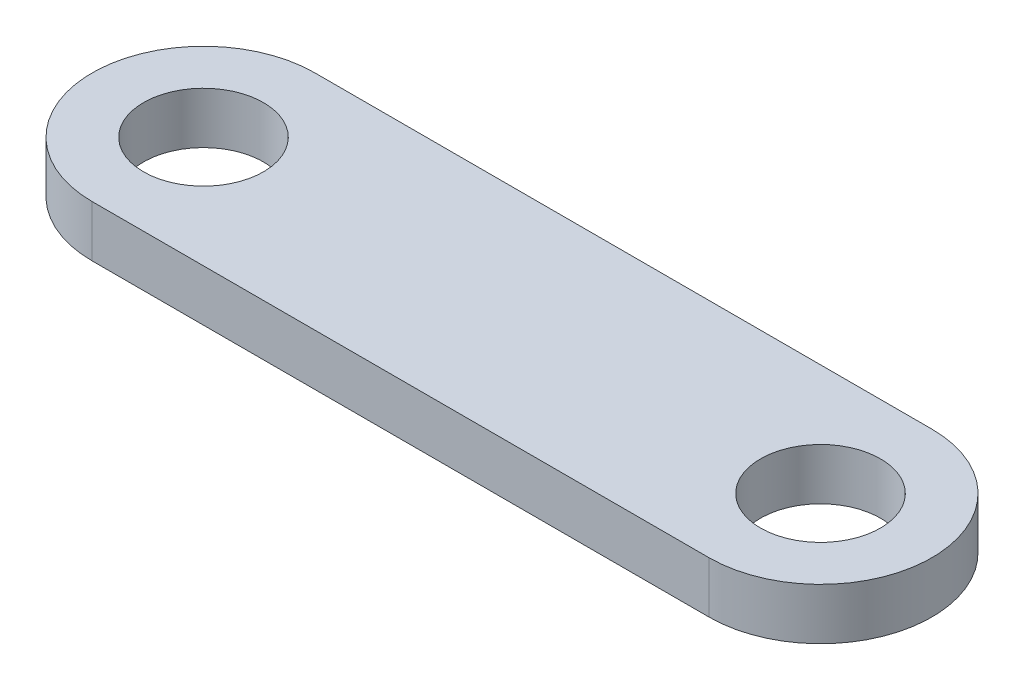
ISO-10303-21;
HEADER;
FILE_DESCRIPTION(('STEP AP214'),'2;1');
FILE_NAME('part.step','',(''),(''),'','','');
FILE_SCHEMA(('AUTOMOTIVE_DESIGN { 1 0 10303 214 1 1 1 1 }'));
ENDSEC;
DATA;
#1=APPLICATION_CONTEXT('core data for automotive mechanical design processes');
#2=APPLICATION_PROTOCOL_DEFINITION('international standard','automotive_design',2000,#1);
#3=PRODUCT_CONTEXT('',#1,'mechanical');
#4=PRODUCT('Part','Part','',(#3));
#5=PRODUCT_RELATED_PRODUCT_CATEGORY('part','',(#4));
#6=PRODUCT_DEFINITION_FORMATION('','',#4);
#7=PRODUCT_DEFINITION_CONTEXT('part definition',#1,'design');
#8=PRODUCT_DEFINITION('design','',#6,#7);
#9=PRODUCT_DEFINITION_SHAPE('','',#8);
#10=(LENGTH_UNIT() NAMED_UNIT(*) SI_UNIT(.MILLI.,.METRE.));
#11=(NAMED_UNIT(*) PLANE_ANGLE_UNIT() SI_UNIT($,.RADIAN.));
#12=(NAMED_UNIT(*) SI_UNIT($,.STERADIAN.) SOLID_ANGLE_UNIT());
#13=UNCERTAINTY_MEASURE_WITH_UNIT(LENGTH_MEASURE(1.E-05),#10,'distance_accuracy_value','');
#14=(GEOMETRIC_REPRESENTATION_CONTEXT(3) GLOBAL_UNCERTAINTY_ASSIGNED_CONTEXT((#13)) GLOBAL_UNIT_ASSIGNED_CONTEXT((#10,
#11,#12)) REPRESENTATION_CONTEXT('',''));
#15=CARTESIAN_POINT('',(0.,0.,0.));
#16=DIRECTION('',(0.,0.,1.));
#17=DIRECTION('',(1.,0.,0.));
#18=AXIS2_PLACEMENT_3D('',#15,#16,#17);
#19=CARTESIAN_POINT('',(-18.,3.,0.));
#20=DIRECTION('',(0.,1.,0.));
#21=DIRECTION('',(0.,0.,1.));
#22=AXIS2_PLACEMENT_3D('',#19,#20,#21);
#23=PLANE('',#22);
#24=CARTESIAN_POINT('',(-18.,3.,0.));
#25=DIRECTION('',(0.,1.,0.));
#26=DIRECTION('',(0.,0.,1.));
#27=AXIS2_PLACEMENT_3D('',#24,#25,#26);
#28=CIRCLE('',#27,3.5);
#29=CARTESIAN_POINT('',(-18.,3.,3.5));
#30=VERTEX_POINT('',#29);
#31=EDGE_CURVE('E100',#30,#30,#28,.T.);
#32=ORIENTED_EDGE('',*,*,#31,.F.);
#33=EDGE_LOOP('',(#32));
#34=FACE_BOUND('',#33,.T.);
#35=CARTESIAN_POINT('',(-18.,3.,0.));
#36=DIRECTION('',(0.,1.,0.));
#37=DIRECTION('',(0.,0.,1.));
#38=AXIS2_PLACEMENT_3D('',#35,#36,#37);
#39=CIRCLE('',#38,6.50000000000001);
#40=CARTESIAN_POINT('',(-18.,3.,-6.50000000000001));
#41=VERTEX_POINT('',#40);
#42=CARTESIAN_POINT('',(-18.,3.,6.50000000000001));
#43=VERTEX_POINT('',#42);
#44=EDGE_CURVE('E85',#41,#43,#39,.T.);
#45=ORIENTED_EDGE('',*,*,#44,.T.);
#46=DIRECTION('',(1.,0.,0.));
#47=VECTOR('',#46,1.);
#48=CARTESIAN_POINT('',(-18.,3.,6.50000000000001));
#49=LINE('',#48,#47);
#50=CARTESIAN_POINT('',(18.,3.,6.5));
#51=VERTEX_POINT('',#50);
#52=EDGE_CURVE('E80',#43,#51,#49,.T.);
#53=ORIENTED_EDGE('',*,*,#52,.T.);
#54=CARTESIAN_POINT('',(18.,3.,0.));
#55=DIRECTION('',(0.,1.,0.));
#56=DIRECTION('',(0.,0.,1.));
#57=AXIS2_PLACEMENT_3D('',#54,#55,#56);
#58=CIRCLE('',#57,6.50000000000001);
#59=CARTESIAN_POINT('',(18.,3.,-6.50000000000001));
#60=VERTEX_POINT('',#59);
#61=EDGE_CURVE('E83',#51,#60,#58,.T.);
#62=ORIENTED_EDGE('',*,*,#61,.T.);
#63=DIRECTION('',(-1.,0.,0.));
#64=VECTOR('',#63,1.);
#65=CARTESIAN_POINT('',(-18.,3.,-6.50000000000001));
#66=LINE('',#65,#64);
#67=EDGE_CURVE('E50',#60,#41,#66,.T.);
#68=ORIENTED_EDGE('',*,*,#67,.T.);
#69=EDGE_LOOP('',(#45,#53,#62,#68));
#70=FACE_BOUND('',#69,.T.);
#71=CARTESIAN_POINT('',(18.,3.,0.));
#72=DIRECTION('',(0.,1.,0.));
#73=DIRECTION('',(0.,0.,1.));
#74=AXIS2_PLACEMENT_3D('',#71,#72,#73);
#75=CIRCLE('',#74,3.5);
#76=CARTESIAN_POINT('',(18.,3.,3.49999999999999));
#77=VERTEX_POINT('',#76);
#78=EDGE_CURVE('E115',#77,#77,#75,.T.);
#79=ORIENTED_EDGE('',*,*,#78,.F.);
#80=EDGE_LOOP('',(#79));
#81=FACE_BOUND('',#80,.T.);
#82=ADVANCED_FACE('F33',(#34,#70,#81),#23,.T.);
#83=CARTESIAN_POINT('',(-18.,0.,0.));
#84=DIRECTION('',(0.,1.,0.));
#85=DIRECTION('',(0.,0.,1.));
#86=AXIS2_PLACEMENT_3D('',#83,#84,#85);
#87=PLANE('',#86);
#88=CARTESIAN_POINT('',(-18.,0.,0.));
#89=DIRECTION('',(0.,1.,0.));
#90=DIRECTION('',(0.,0.,1.));
#91=AXIS2_PLACEMENT_3D('',#88,#89,#90);
#92=CIRCLE('',#91,6.50000000000001);
#93=CARTESIAN_POINT('',(-18.,0.,-6.50000000000001));
#94=VERTEX_POINT('',#93);
#95=CARTESIAN_POINT('',(-18.,0.,6.50000000000001));
#96=VERTEX_POINT('',#95);
#97=EDGE_CURVE('E97',#94,#96,#92,.T.);
#98=ORIENTED_EDGE('',*,*,#97,.F.);
#99=DIRECTION('',(-1.,0.,0.));
#100=VECTOR('',#99,1.);
#101=CARTESIAN_POINT('',(-18.,0.,-6.50000000000001));
#102=LINE('',#101,#100);
#103=CARTESIAN_POINT('',(18.,0.,-6.50000000000001));
#104=VERTEX_POINT('',#103);
#105=EDGE_CURVE('E73',#104,#94,#102,.T.);
#106=ORIENTED_EDGE('',*,*,#105,.F.);
#107=CARTESIAN_POINT('',(18.,0.,0.));
#108=DIRECTION('',(0.,1.,0.));
#109=DIRECTION('',(0.,0.,1.));
#110=AXIS2_PLACEMENT_3D('',#107,#108,#109);
#111=CIRCLE('',#110,6.50000000000001);
#112=CARTESIAN_POINT('',(18.,0.,6.5));
#113=VERTEX_POINT('',#112);
#114=EDGE_CURVE('E67',#113,#104,#111,.T.);
#115=ORIENTED_EDGE('',*,*,#114,.F.);
#116=DIRECTION('',(1.,0.,0.));
#117=VECTOR('',#116,1.);
#118=CARTESIAN_POINT('',(-18.,0.,6.50000000000001));
#119=LINE('',#118,#117);
#120=EDGE_CURVE('E89',#96,#113,#119,.T.);
#121=ORIENTED_EDGE('',*,*,#120,.F.);
#122=EDGE_LOOP('',(#98,#106,#115,#121));
#123=FACE_BOUND('',#122,.T.);
#124=CARTESIAN_POINT('',(-18.,0.,0.));
#125=DIRECTION('',(0.,1.,0.));
#126=DIRECTION('',(0.,0.,1.));
#127=AXIS2_PLACEMENT_3D('',#124,#125,#126);
#128=CIRCLE('',#127,3.5);
#129=CARTESIAN_POINT('',(-18.,0.,3.5));
#130=VERTEX_POINT('',#129);
#131=EDGE_CURVE('E112',#130,#130,#128,.T.);
#132=ORIENTED_EDGE('',*,*,#131,.T.);
#133=EDGE_LOOP('',(#132));
#134=FACE_BOUND('',#133,.T.);
#135=CARTESIAN_POINT('',(18.,0.,0.));
#136=DIRECTION('',(0.,1.,0.));
#137=DIRECTION('',(0.,0.,1.));
#138=AXIS2_PLACEMENT_3D('',#135,#136,#137);
#139=CIRCLE('',#138,3.5);
#140=CARTESIAN_POINT('',(18.,0.,3.49999999999999));
#141=VERTEX_POINT('',#140);
#142=EDGE_CURVE('E118',#141,#141,#139,.T.);
#143=ORIENTED_EDGE('',*,*,#142,.T.);
#144=EDGE_LOOP('',(#143));
#145=FACE_BOUND('',#144,.T.);
#146=ADVANCED_FACE('F108',(#123,#134,#145),#87,.F.);
#147=CARTESIAN_POINT('',(-18.,3.,0.));
#148=DIRECTION('',(0.,-1.,0.));
#149=DIRECTION('',(0.,0.,-1.));
#150=AXIS2_PLACEMENT_3D('',#147,#148,#149);
#151=CYLINDRICAL_SURFACE('',#150,6.50000000000001);
#152=ORIENTED_EDGE('',*,*,#97,.T.);
#153=DIRECTION('',(0.,-1.,0.));
#154=VECTOR('',#153,1.);
#155=CARTESIAN_POINT('',(-18.,3.,6.50000000000001));
#156=LINE('',#155,#154);
#157=EDGE_CURVE('E11',#43,#96,#156,.T.);
#158=ORIENTED_EDGE('',*,*,#157,.F.);
#159=ORIENTED_EDGE('',*,*,#44,.F.);
#160=DIRECTION('',(0.,-1.,0.));
#161=VECTOR('',#160,1.);
#162=CARTESIAN_POINT('',(-18.,3.,-6.50000000000001));
#163=LINE('',#162,#161);
#164=EDGE_CURVE('E93',#41,#94,#163,.T.);
#165=ORIENTED_EDGE('',*,*,#164,.T.);
#166=EDGE_LOOP('',(#152,#158,#159,#165));
#167=FACE_BOUND('',#166,.T.);
#168=ADVANCED_FACE('F35',(#167),#151,.T.);
#169=CARTESIAN_POINT('',(-18.,3.,6.50000000000001));
#170=DIRECTION('',(0.,0.,-1.));
#171=DIRECTION('',(-1.,0.,0.));
#172=AXIS2_PLACEMENT_3D('',#169,#170,#171);
#173=PLANE('',#172);
#174=ORIENTED_EDGE('',*,*,#120,.T.);
#175=DIRECTION('',(0.,-1.,0.));
#176=VECTOR('',#175,1.);
#177=CARTESIAN_POINT('',(18.,3.,6.5));
#178=LINE('',#177,#176);
#179=EDGE_CURVE('E42',#51,#113,#178,.T.);
#180=ORIENTED_EDGE('',*,*,#179,.F.);
#181=ORIENTED_EDGE('',*,*,#52,.F.);
#182=ORIENTED_EDGE('',*,*,#157,.T.);
#183=EDGE_LOOP('',(#174,#180,#181,#182));
#184=FACE_BOUND('',#183,.T.);
#185=ADVANCED_FACE('F88',(#184),#173,.F.);
#186=CARTESIAN_POINT('',(18.,3.,0.));
#187=DIRECTION('',(0.,-1.,0.));
#188=DIRECTION('',(0.,0.,-1.));
#189=AXIS2_PLACEMENT_3D('',#186,#187,#188);
#190=CYLINDRICAL_SURFACE('',#189,6.50000000000001);
#191=ORIENTED_EDGE('',*,*,#114,.T.);
#192=DIRECTION('',(0.,-1.,0.));
#193=VECTOR('',#192,1.);
#194=CARTESIAN_POINT('',(18.,3.,-6.50000000000001));
#195=LINE('',#194,#193);
#196=EDGE_CURVE('E90',#60,#104,#195,.T.);
#197=ORIENTED_EDGE('',*,*,#196,.F.);
#198=ORIENTED_EDGE('',*,*,#61,.F.);
#199=ORIENTED_EDGE('',*,*,#179,.T.);
#200=EDGE_LOOP('',(#191,#197,#198,#199));
#201=FACE_BOUND('',#200,.T.);
#202=ADVANCED_FACE('F91',(#201),#190,.T.);
#203=CARTESIAN_POINT('',(-18.,3.,-6.50000000000001));
#204=DIRECTION('',(0.,0.,1.));
#205=DIRECTION('',(1.,0.,0.));
#206=AXIS2_PLACEMENT_3D('',#203,#204,#205);
#207=PLANE('',#206);
#208=ORIENTED_EDGE('',*,*,#105,.T.);
#209=ORIENTED_EDGE('',*,*,#164,.F.);
#210=ORIENTED_EDGE('',*,*,#67,.F.);
#211=ORIENTED_EDGE('',*,*,#196,.T.);
#212=EDGE_LOOP('',(#208,#209,#210,#211));
#213=FACE_BOUND('',#212,.T.);
#214=ADVANCED_FACE('F105',(#213),#207,.F.);
#215=CARTESIAN_POINT('',(-18.,3.,0.));
#216=DIRECTION('',(0.,-1.,0.));
#217=DIRECTION('',(0.,0.,-1.));
#218=AXIS2_PLACEMENT_3D('',#215,#216,#217);
#219=CYLINDRICAL_SURFACE('',#218,3.5);
#220=ORIENTED_EDGE('',*,*,#31,.T.);
#221=EDGE_LOOP('',(#220));
#222=FACE_BOUND('',#221,.T.);
#223=ORIENTED_EDGE('',*,*,#131,.F.);
#224=EDGE_LOOP('',(#223));
#225=FACE_BOUND('',#224,.T.);
#226=ADVANCED_FACE('F135',(#222,#225),#219,.F.);
#227=CARTESIAN_POINT('',(18.,3.,0.));
#228=DIRECTION('',(0.,-1.,0.));
#229=DIRECTION('',(0.,0.,-1.));
#230=AXIS2_PLACEMENT_3D('',#227,#228,#229);
#231=CYLINDRICAL_SURFACE('',#230,3.5);
#232=ORIENTED_EDGE('',*,*,#78,.T.);
#233=EDGE_LOOP('',(#232));
#234=FACE_BOUND('',#233,.T.);
#235=ORIENTED_EDGE('',*,*,#142,.F.);
#236=EDGE_LOOP('',(#235));
#237=FACE_BOUND('',#236,.T.);
#238=ADVANCED_FACE('F124',(#234,#237),#231,.F.);
#239=CLOSED_SHELL('',(#82,#146,#168,#185,#202,#214,#226,#238));
#240=MANIFOLD_SOLID_BREP('B2',#239);
#241=ADVANCED_BREP_SHAPE_REPRESENTATION('',(#18,#240),#14);
#242=SHAPE_DEFINITION_REPRESENTATION(#9,#241);
ENDSEC;
END-ISO-10303-21;
